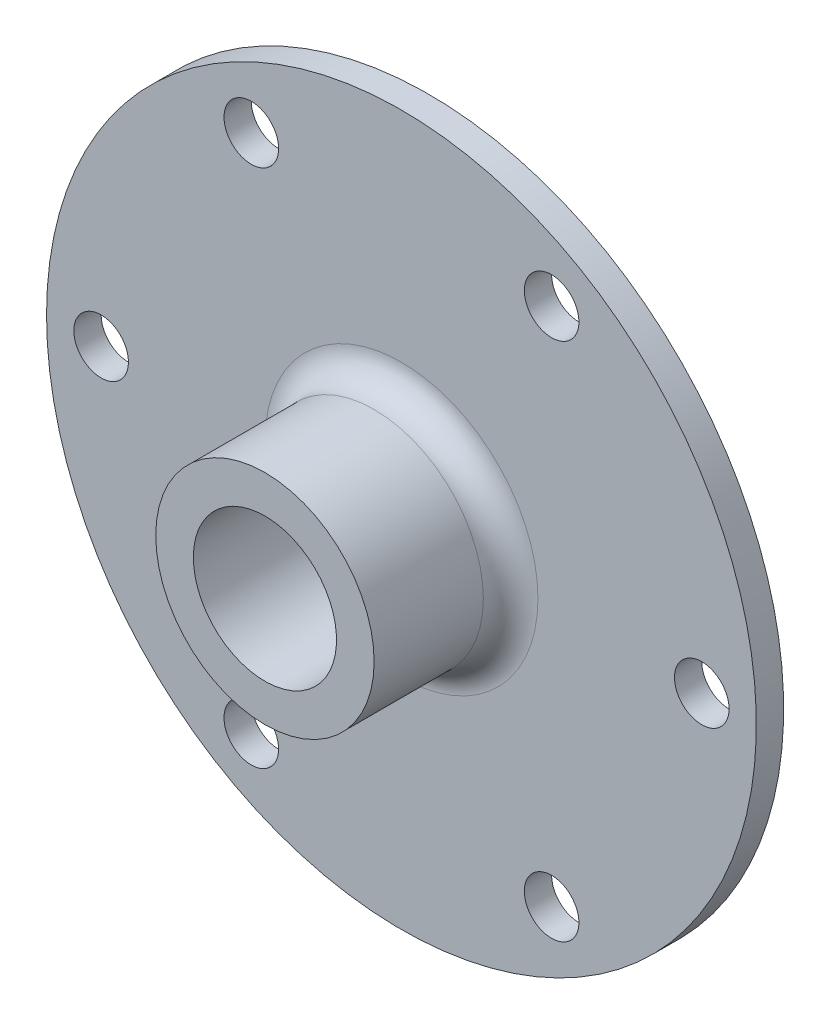
ISO-10303-21;
HEADER;
FILE_DESCRIPTION(('STEP AP214'),'2;1');
FILE_NAME('part.step','',(''),(''),'','','');
FILE_SCHEMA(('AUTOMOTIVE_DESIGN { 1 0 10303 214 1 1 1 1 }'));
ENDSEC;
DATA;
#1=APPLICATION_CONTEXT('core data for automotive mechanical design processes');
#2=APPLICATION_PROTOCOL_DEFINITION('international standard','automotive_design',2000,#1);
#3=PRODUCT_CONTEXT('',#1,'mechanical');
#4=PRODUCT('Part','Part','',(#3));
#5=PRODUCT_RELATED_PRODUCT_CATEGORY('part','',(#4));
#6=PRODUCT_DEFINITION_FORMATION('','',#4);
#7=PRODUCT_DEFINITION_CONTEXT('part definition',#1,'design');
#8=PRODUCT_DEFINITION('design','',#6,#7);
#9=PRODUCT_DEFINITION_SHAPE('','',#8);
#10=(LENGTH_UNIT() NAMED_UNIT(*) SI_UNIT(.MILLI.,.METRE.));
#11=(NAMED_UNIT(*) PLANE_ANGLE_UNIT() SI_UNIT($,.RADIAN.));
#12=(NAMED_UNIT(*) SI_UNIT($,.STERADIAN.) SOLID_ANGLE_UNIT());
#13=UNCERTAINTY_MEASURE_WITH_UNIT(LENGTH_MEASURE(1.E-05),#10,'distance_accuracy_value','');
#14=(GEOMETRIC_REPRESENTATION_CONTEXT(3) GLOBAL_UNCERTAINTY_ASSIGNED_CONTEXT((#13)) GLOBAL_UNIT_ASSIGNED_CONTEXT((#10,
#11,#12)) REPRESENTATION_CONTEXT('',''));
#15=CARTESIAN_POINT('',(0.,0.,0.));
#16=DIRECTION('',(0.,0.,1.));
#17=DIRECTION('',(1.,0.,0.));
#18=AXIS2_PLACEMENT_3D('',#15,#16,#17);
#19=CARTESIAN_POINT('',(0.,0.,19.05));
#20=DIRECTION('',(0.,0.,1.));
#21=DIRECTION('',(1.,0.,0.));
#22=AXIS2_PLACEMENT_3D('',#19,#20,#21);
#23=PLANE('',#22);
#24=CARTESIAN_POINT('',(0.,0.,19.05));
#25=DIRECTION('',(0.,0.,-1.));
#26=DIRECTION('',(-1.,0.,0.));
#27=AXIS2_PLACEMENT_3D('',#24,#25,#26);
#28=CIRCLE('',#27,12.7);
#29=CARTESIAN_POINT('',(-12.7,0.,19.05));
#30=VERTEX_POINT('',#29);
#31=EDGE_CURVE('E42',#30,#30,#28,.T.);
#32=ORIENTED_EDGE('',*,*,#31,.F.);
#33=EDGE_LOOP('',(#32));
#34=FACE_BOUND('',#33,.T.);
#35=CARTESIAN_POINT('',(0.,0.,19.05));
#36=DIRECTION('',(0.,0.,1.));
#37=DIRECTION('',(1.,0.,0.));
#38=AXIS2_PLACEMENT_3D('',#35,#36,#37);
#39=CIRCLE('',#38,8.32477297751053);
#40=CARTESIAN_POINT('',(-8.32477297751053,0.,19.05));
#41=VERTEX_POINT('',#40);
#42=EDGE_CURVE('E54',#41,#41,#39,.T.);
#43=ORIENTED_EDGE('',*,*,#42,.F.);
#44=EDGE_LOOP('',(#43));
#45=FACE_BOUND('',#44,.T.);
#46=ADVANCED_FACE('F31',(#34,#45),#23,.T.);
#47=CARTESIAN_POINT('',(0.,0.,0.));
#48=DIRECTION('',(0.,0.,-1.));
#49=DIRECTION('',(-1.,0.,0.));
#50=AXIS2_PLACEMENT_3D('',#47,#48,#49);
#51=PLANE('',#50);
#52=CARTESIAN_POINT('',(17.4625000000004,30.2459372271713,0.));
#53=DIRECTION('',(0.,0.,1.));
#54=DIRECTION('',(0.50000000000001,0.866025403784433,0.));
#55=AXIS2_PLACEMENT_3D('',#52,#53,#54);
#56=CIRCLE('',#55,3.175);
#57=CARTESIAN_POINT('',(19.0500000000004,32.9955678841869,0.));
#58=VERTEX_POINT('',#57);
#59=EDGE_CURVE('E88',#58,#58,#56,.T.);
#60=ORIENTED_EDGE('',*,*,#59,.T.);
#61=EDGE_LOOP('',(#60));
#62=FACE_BOUND('',#61,.T.);
#63=CARTESIAN_POINT('',(-17.4624999999997,30.2459372271717,0.));
#64=DIRECTION('',(0.,0.,1.));
#65=DIRECTION('',(-0.499999999999992,0.866025403784443,0.));
#66=AXIS2_PLACEMENT_3D('',#63,#64,#65);
#67=CIRCLE('',#66,3.175);
#68=CARTESIAN_POINT('',(-19.0499999999997,32.9955678841873,0.));
#69=VERTEX_POINT('',#68);
#70=EDGE_CURVE('E82',#69,#69,#67,.T.);
#71=ORIENTED_EDGE('',*,*,#70,.T.);
#72=EDGE_LOOP('',(#71));
#73=FACE_BOUND('',#72,.T.);
#74=CARTESIAN_POINT('',(-34.925,0.,0.));
#75=DIRECTION('',(0.,0.,1.));
#76=DIRECTION('',(-1.,0.,0.));
#77=AXIS2_PLACEMENT_3D('',#74,#75,#76);
#78=CIRCLE('',#77,3.175);
#79=CARTESIAN_POINT('',(-38.1,0.,0.));
#80=VERTEX_POINT('',#79);
#81=EDGE_CURVE('E76',#80,#80,#78,.T.);
#82=ORIENTED_EDGE('',*,*,#81,.T.);
#83=EDGE_LOOP('',(#82));
#84=FACE_BOUND('',#83,.T.);
#85=CARTESIAN_POINT('',(-17.4625000000001,-30.2459372271714,0.));
#86=DIRECTION('',(0.,0.,1.));
#87=DIRECTION('',(-0.500000000000004,-0.866025403784436,0.));
#88=AXIS2_PLACEMENT_3D('',#85,#86,#87);
#89=CIRCLE('',#88,3.175);
#90=CARTESIAN_POINT('',(-19.0500000000002,-32.995567884187,0.));
#91=VERTEX_POINT('',#90);
#92=EDGE_CURVE('E70',#91,#91,#89,.T.);
#93=ORIENTED_EDGE('',*,*,#92,.T.);
#94=EDGE_LOOP('',(#93));
#95=FACE_BOUND('',#94,.T.);
#96=CARTESIAN_POINT('',(17.4624999999999,-30.2459372271716,0.));
#97=DIRECTION('',(0.,0.,1.));
#98=DIRECTION('',(0.499999999999998,-0.86602540378444,0.));
#99=AXIS2_PLACEMENT_3D('',#96,#97,#98);
#100=CIRCLE('',#99,3.175);
#101=CARTESIAN_POINT('',(19.0499999999999,-32.9955678841872,0.));
#102=VERTEX_POINT('',#101);
#103=EDGE_CURVE('E64',#102,#102,#100,.T.);
#104=ORIENTED_EDGE('',*,*,#103,.T.);
#105=EDGE_LOOP('',(#104));
#106=FACE_BOUND('',#105,.T.);
#107=CARTESIAN_POINT('',(34.925,0.,0.));
#108=DIRECTION('',(0.,0.,1.));
#109=DIRECTION('',(1.,0.,0.));
#110=AXIS2_PLACEMENT_3D('',#107,#108,#109);
#111=CIRCLE('',#110,3.175);
#112=CARTESIAN_POINT('',(38.1,0.,0.));
#113=VERTEX_POINT('',#112);
#114=EDGE_CURVE('E58',#113,#113,#111,.T.);
#115=ORIENTED_EDGE('',*,*,#114,.T.);
#116=EDGE_LOOP('',(#115));
#117=FACE_BOUND('',#116,.T.);
#118=CARTESIAN_POINT('',(0.,0.,0.));
#119=DIRECTION('',(0.,0.,-1.));
#120=DIRECTION('',(-1.,0.,0.));
#121=AXIS2_PLACEMENT_3D('',#118,#119,#120);
#122=CIRCLE('',#121,41.275);
#123=CARTESIAN_POINT('',(-41.275,0.,0.));
#124=VERTEX_POINT('',#123);
#125=EDGE_CURVE('E51',#124,#124,#122,.T.);
#126=ORIENTED_EDGE('',*,*,#125,.T.);
#127=EDGE_LOOP('',(#126));
#128=FACE_BOUND('',#127,.T.);
#129=CARTESIAN_POINT('',(0.,0.,0.));
#130=DIRECTION('',(0.,0.,1.));
#131=DIRECTION('',(1.,0.,0.));
#132=AXIS2_PLACEMENT_3D('',#129,#130,#131);
#133=CIRCLE('',#132,8.32477297751053);
#134=CARTESIAN_POINT('',(-8.32477297751053,0.,0.));
#135=VERTEX_POINT('',#134);
#136=EDGE_CURVE('E55',#135,#135,#133,.T.);
#137=ORIENTED_EDGE('',*,*,#136,.T.);
#138=EDGE_LOOP('',(#137));
#139=FACE_BOUND('',#138,.T.);
#140=ADVANCED_FACE('F97',(#62,#73,#84,#95,#106,#117,#128,#139),#51,.T.);
#141=CARTESIAN_POINT('',(0.,0.,0.));
#142=DIRECTION('',(0.,0.,-1.));
#143=DIRECTION('',(-1.,0.,0.));
#144=AXIS2_PLACEMENT_3D('',#141,#142,#143);
#145=CYLINDRICAL_SURFACE('',#144,12.7);
#146=CARTESIAN_POINT('',(0.,0.,6.35));
#147=DIRECTION('',(0.,0.,1.));
#148=DIRECTION('',(1.,0.,0.));
#149=AXIS2_PLACEMENT_3D('',#146,#147,#148);
#150=CIRCLE('',#149,12.7);
#151=CARTESIAN_POINT('',(12.7,0.,6.35));
#152=VERTEX_POINT('',#151);
#153=EDGE_CURVE('E10',#152,#152,#150,.T.);
#154=ORIENTED_EDGE('',*,*,#153,.T.);
#155=EDGE_LOOP('',(#154));
#156=FACE_BOUND('',#155,.T.);
#157=ORIENTED_EDGE('',*,*,#31,.T.);
#158=EDGE_LOOP('',(#157));
#159=FACE_BOUND('',#158,.T.);
#160=ADVANCED_FACE('F111',(#156,#159),#145,.T.);
#161=CARTESIAN_POINT('',(0.,12.7,3.175));
#162=DIRECTION('',(0.,0.,1.));
#163=DIRECTION('',(1.,0.,0.));
#164=AXIS2_PLACEMENT_3D('',#161,#162,#163);
#165=PLANE('',#164);
#166=CARTESIAN_POINT('',(0.,0.,3.175));
#167=DIRECTION('',(0.,0.,1.));
#168=DIRECTION('',(1.,0.,0.));
#169=AXIS2_PLACEMENT_3D('',#166,#167,#168);
#170=CIRCLE('',#169,15.875);
#171=CARTESIAN_POINT('',(15.875,0.,3.175));
#172=VERTEX_POINT('',#171);
#173=EDGE_CURVE('E38',#172,#172,#170,.F.);
#174=ORIENTED_EDGE('',*,*,#173,.T.);
#175=EDGE_LOOP('',(#174));
#176=FACE_BOUND('',#175,.T.);
#177=CARTESIAN_POINT('',(17.4625000000004,30.2459372271713,3.175));
#178=DIRECTION('',(0.,0.,1.));
#179=DIRECTION('',(0.50000000000001,0.866025403784433,0.));
#180=AXIS2_PLACEMENT_3D('',#177,#178,#179);
#181=CIRCLE('',#180,3.175);
#182=CARTESIAN_POINT('',(19.0500000000004,32.9955678841869,3.175));
#183=VERTEX_POINT('',#182);
#184=EDGE_CURVE('E91',#183,#183,#181,.T.);
#185=ORIENTED_EDGE('',*,*,#184,.F.);
#186=EDGE_LOOP('',(#185));
#187=FACE_BOUND('',#186,.T.);
#188=CARTESIAN_POINT('',(-17.4624999999997,30.2459372271717,3.175));
#189=DIRECTION('',(0.,0.,1.));
#190=DIRECTION('',(-0.499999999999992,0.866025403784443,0.));
#191=AXIS2_PLACEMENT_3D('',#188,#189,#190);
#192=CIRCLE('',#191,3.175);
#193=CARTESIAN_POINT('',(-19.0499999999997,32.9955678841873,3.175));
#194=VERTEX_POINT('',#193);
#195=EDGE_CURVE('E85',#194,#194,#192,.T.);
#196=ORIENTED_EDGE('',*,*,#195,.F.);
#197=EDGE_LOOP('',(#196));
#198=FACE_BOUND('',#197,.T.);
#199=CARTESIAN_POINT('',(-34.925,0.,3.175));
#200=DIRECTION('',(0.,0.,1.));
#201=DIRECTION('',(-1.,0.,0.));
#202=AXIS2_PLACEMENT_3D('',#199,#200,#201);
#203=CIRCLE('',#202,3.175);
#204=CARTESIAN_POINT('',(-38.1,0.,3.175));
#205=VERTEX_POINT('',#204);
#206=EDGE_CURVE('E79',#205,#205,#203,.T.);
#207=ORIENTED_EDGE('',*,*,#206,.F.);
#208=EDGE_LOOP('',(#207));
#209=FACE_BOUND('',#208,.T.);
#210=CARTESIAN_POINT('',(-17.4625000000001,-30.2459372271714,3.175));
#211=DIRECTION('',(0.,0.,1.));
#212=DIRECTION('',(-0.500000000000004,-0.866025403784436,0.));
#213=AXIS2_PLACEMENT_3D('',#210,#211,#212);
#214=CIRCLE('',#213,3.175);
#215=CARTESIAN_POINT('',(-19.0500000000002,-32.995567884187,3.175));
#216=VERTEX_POINT('',#215);
#217=EDGE_CURVE('E73',#216,#216,#214,.T.);
#218=ORIENTED_EDGE('',*,*,#217,.F.);
#219=EDGE_LOOP('',(#218));
#220=FACE_BOUND('',#219,.T.);
#221=CARTESIAN_POINT('',(17.4624999999999,-30.2459372271716,3.175));
#222=DIRECTION('',(0.,0.,1.));
#223=DIRECTION('',(0.499999999999998,-0.86602540378444,0.));
#224=AXIS2_PLACEMENT_3D('',#221,#222,#223);
#225=CIRCLE('',#224,3.175);
#226=CARTESIAN_POINT('',(19.0499999999999,-32.9955678841872,3.175));
#227=VERTEX_POINT('',#226);
#228=EDGE_CURVE('E67',#227,#227,#225,.T.);
#229=ORIENTED_EDGE('',*,*,#228,.F.);
#230=EDGE_LOOP('',(#229));
#231=FACE_BOUND('',#230,.T.);
#232=CARTESIAN_POINT('',(34.925,0.,3.175));
#233=DIRECTION('',(0.,0.,1.));
#234=DIRECTION('',(1.,0.,0.));
#235=AXIS2_PLACEMENT_3D('',#232,#233,#234);
#236=CIRCLE('',#235,3.175);
#237=CARTESIAN_POINT('',(38.1,0.,3.175));
#238=VERTEX_POINT('',#237);
#239=EDGE_CURVE('E61',#238,#238,#236,.T.);
#240=ORIENTED_EDGE('',*,*,#239,.F.);
#241=EDGE_LOOP('',(#240));
#242=FACE_BOUND('',#241,.T.);
#243=CARTESIAN_POINT('',(0.,0.,3.175));
#244=DIRECTION('',(0.,0.,-1.));
#245=DIRECTION('',(-1.,0.,0.));
#246=AXIS2_PLACEMENT_3D('',#243,#244,#245);
#247=CIRCLE('',#246,41.275);
#248=CARTESIAN_POINT('',(-41.275,0.,3.175));
#249=VERTEX_POINT('',#248);
#250=EDGE_CURVE('E46',#249,#249,#247,.T.);
#251=ORIENTED_EDGE('',*,*,#250,.F.);
#252=EDGE_LOOP('',(#251));
#253=FACE_BOUND('',#252,.T.);
#254=ADVANCED_FACE('F107',(#176,#187,#198,#209,#220,#231,#242,#253),#165,.T.);
#255=CARTESIAN_POINT('',(0.,0.,0.));
#256=DIRECTION('',(0.,0.,-1.));
#257=DIRECTION('',(-1.,0.,0.));
#258=AXIS2_PLACEMENT_3D('',#255,#256,#257);
#259=CYLINDRICAL_SURFACE('',#258,41.275);
#260=ORIENTED_EDGE('',*,*,#250,.T.);
#261=EDGE_LOOP('',(#260));
#262=FACE_BOUND('',#261,.T.);
#263=ORIENTED_EDGE('',*,*,#125,.F.);
#264=EDGE_LOOP('',(#263));
#265=FACE_BOUND('',#264,.T.);
#266=ADVANCED_FACE('F110',(#262,#265),#259,.T.);
#267=CARTESIAN_POINT('',(0.,0.,19.05));
#268=DIRECTION('',(0.,0.,-1.));
#269=DIRECTION('',(-1.,0.,0.));
#270=AXIS2_PLACEMENT_3D('',#267,#268,#269);
#271=CYLINDRICAL_SURFACE('',#270,8.32477297751053);
#272=CARTESIAN_POINT('',(-8.32477297751053,0.,19.05));
#273=CARTESIAN_POINT('',(-8.32477297751053,0.,18.8515625));
#274=CARTESIAN_POINT('',(-8.32477297751053,0.,18.653125));
#275=CARTESIAN_POINT('',(-8.32477297751053,0.,18.25625));
#276=CARTESIAN_POINT('',(-8.32477297751053,0.,18.0578125));
#277=CARTESIAN_POINT('',(-8.32477297751053,0.,17.6609375));
#278=CARTESIAN_POINT('',(-8.32477297751053,0.,17.4625));
#279=CARTESIAN_POINT('',(-8.32477297751053,0.,17.065625));
#280=CARTESIAN_POINT('',(-8.32477297751053,0.,16.8671875));
#281=CARTESIAN_POINT('',(-8.32477297751053,0.,16.4703125));
#282=CARTESIAN_POINT('',(-8.32477297751053,0.,16.271875));
#283=CARTESIAN_POINT('',(-8.32477297751053,0.,15.875));
#284=CARTESIAN_POINT('',(-8.32477297751053,0.,15.6765625));
#285=CARTESIAN_POINT('',(-8.32477297751053,0.,15.2796875));
#286=CARTESIAN_POINT('',(-8.32477297751053,0.,15.08125));
#287=CARTESIAN_POINT('',(-8.32477297751053,0.,14.684375));
#288=CARTESIAN_POINT('',(-8.32477297751053,0.,14.4859375));
#289=CARTESIAN_POINT('',(-8.32477297751053,0.,14.0890625));
#290=CARTESIAN_POINT('',(-8.32477297751053,0.,13.890625));
#291=CARTESIAN_POINT('',(-8.32477297751053,0.,13.49375));
#292=CARTESIAN_POINT('',(-8.32477297751053,0.,13.2953125));
#293=CARTESIAN_POINT('',(-8.32477297751053,0.,12.8984375));
#294=CARTESIAN_POINT('',(-8.32477297751053,0.,12.7));
#295=CARTESIAN_POINT('',(-8.32477297751053,0.,12.303125));
#296=CARTESIAN_POINT('',(-8.32477297751053,0.,12.1046875));
#297=CARTESIAN_POINT('',(-8.32477297751053,0.,11.7078125));
#298=CARTESIAN_POINT('',(-8.32477297751053,0.,11.509375));
#299=CARTESIAN_POINT('',(-8.32477297751053,0.,11.1125));
#300=CARTESIAN_POINT('',(-8.32477297751053,0.,10.9140625));
#301=CARTESIAN_POINT('',(-8.32477297751053,0.,10.5171875));
#302=CARTESIAN_POINT('',(-8.32477297751053,0.,10.31875));
#303=CARTESIAN_POINT('',(-8.32477297751053,0.,9.921875));
#304=CARTESIAN_POINT('',(-8.32477297751053,0.,9.7234375));
#305=CARTESIAN_POINT('',(-8.32477297751053,0.,9.3265625));
#306=CARTESIAN_POINT('',(-8.32477297751053,0.,9.128125));
#307=CARTESIAN_POINT('',(-8.32477297751053,0.,8.73125));
#308=CARTESIAN_POINT('',(-8.32477297751053,0.,8.5328125));
#309=CARTESIAN_POINT('',(-8.32477297751053,0.,8.1359375));
#310=CARTESIAN_POINT('',(-8.32477297751053,0.,7.9375));
#311=CARTESIAN_POINT('',(-8.32477297751053,0.,7.540625));
#312=CARTESIAN_POINT('',(-8.32477297751053,0.,7.3421875));
#313=CARTESIAN_POINT('',(-8.32477297751053,0.,6.9453125));
#314=CARTESIAN_POINT('',(-8.32477297751053,0.,6.746875));
#315=CARTESIAN_POINT('',(-8.32477297751053,0.,6.35));
#316=CARTESIAN_POINT('',(-8.32477297751053,0.,6.1515625));
#317=CARTESIAN_POINT('',(-8.32477297751053,0.,5.7546875));
#318=CARTESIAN_POINT('',(-8.32477297751053,0.,5.55625));
#319=CARTESIAN_POINT('',(-8.32477297751053,0.,5.159375));
#320=CARTESIAN_POINT('',(-8.32477297751053,0.,4.9609375));
#321=CARTESIAN_POINT('',(-8.32477297751053,0.,4.5640625));
#322=CARTESIAN_POINT('',(-8.32477297751053,0.,4.365625));
#323=CARTESIAN_POINT('',(-8.32477297751053,0.,3.96875));
#324=CARTESIAN_POINT('',(-8.32477297751053,0.,3.7703125));
#325=CARTESIAN_POINT('',(-8.32477297751053,0.,3.3734375));
#326=CARTESIAN_POINT('',(-8.32477297751053,0.,3.175));
#327=CARTESIAN_POINT('',(-8.32477297751053,0.,2.778125));
#328=CARTESIAN_POINT('',(-8.32477297751053,0.,2.5796875));
#329=CARTESIAN_POINT('',(-8.32477297751053,0.,2.1828125));
#330=CARTESIAN_POINT('',(-8.32477297751053,0.,1.984375));
#331=CARTESIAN_POINT('',(-8.32477297751053,0.,1.5875));
#332=CARTESIAN_POINT('',(-8.32477297751053,0.,1.3890625));
#333=CARTESIAN_POINT('',(-8.32477297751053,0.,0.992187500000001));
#334=CARTESIAN_POINT('',(-8.32477297751053,0.,0.793750000000001));
#335=CARTESIAN_POINT('',(-8.32477297751053,0.,0.396875));
#336=CARTESIAN_POINT('',(-8.32477297751053,0.,0.1984375));
#337=CARTESIAN_POINT('',(-8.32477297751053,0.,0.));
#338=B_SPLINE_CURVE_WITH_KNOTS('',3,(#272,#273,#274,#275,#276,#277,#278,#279,#280,#281,#282,
#283,#284,#285,#286,#287,#288,#289,#290,#291,#292,#293,#294,#295,#296,#297,#298,#299,#300,#301,
#302,#303,#304,#305,#306,#307,#308,#309,#310,#311,#312,#313,#314,#315,#316,#317,#318,#319,#320,
#321,#322,#323,#324,#325,#326,#327,#328,#329,#330,#331,#332,#333,#334,#335,#336,#337),
.UNSPECIFIED.,.F.,.F.,(4,2,2,2,2,2,2,2,2,2,2,2,2,2,2,2,2,2,2,2,2,2,2,2,2,2,2,2,2,2,2,2,4),(0.,
0.5953125,1.190625,1.7859375,2.38125,2.9765625,3.571875,4.1671875,4.7625,5.3578125,5.953125,
6.5484375,7.14375,7.7390625,8.334375,8.9296875,9.525,10.1203125,10.715625,11.3109375,11.90625,
12.5015625,13.096875,13.6921875,14.2875,14.8828125,15.478125,16.0734375,16.66875,17.2640625,
17.859375,18.4546875,19.05),.UNSPECIFIED.);
#339=EDGE_CURVE('BSEAM127',#41,#135,#338,.T.);
#340=ORIENTED_EDGE('',*,*,#42,.T.);
#341=ORIENTED_EDGE('',*,*,#136,.F.);
#342=ORIENTED_EDGE('',*,*,#339,.T.);
#343=ORIENTED_EDGE('',*,*,#339,.F.);
#344=EDGE_LOOP('',(#340,#342,#341,#343));
#345=FACE_BOUND('',#344,.T.);
#346=ADVANCED_FACE('F127',(#345),#271,.F.);
#347=CARTESIAN_POINT('',(34.925,0.,0.));
#348=DIRECTION('',(0.,0.,1.));
#349=DIRECTION('',(1.,0.,0.));
#350=AXIS2_PLACEMENT_3D('',#347,#348,#349);
#351=CYLINDRICAL_SURFACE('',#350,3.175);
#352=ORIENTED_EDGE('',*,*,#114,.F.);
#353=EDGE_LOOP('',(#352));
#354=FACE_BOUND('',#353,.T.);
#355=ORIENTED_EDGE('',*,*,#239,.T.);
#356=EDGE_LOOP('',(#355));
#357=FACE_BOUND('',#356,.T.);
#358=ADVANCED_FACE('F137',(#354,#357),#351,.F.);
#359=CARTESIAN_POINT('',(17.4624999999999,-30.2459372271716,0.));
#360=DIRECTION('',(0.,0.,1.));
#361=DIRECTION('',(1.,0.,0.));
#362=AXIS2_PLACEMENT_3D('',#359,#360,#361);
#363=CYLINDRICAL_SURFACE('',#362,3.175);
#364=ORIENTED_EDGE('',*,*,#103,.F.);
#365=EDGE_LOOP('',(#364));
#366=FACE_BOUND('',#365,.T.);
#367=ORIENTED_EDGE('',*,*,#228,.T.);
#368=EDGE_LOOP('',(#367));
#369=FACE_BOUND('',#368,.T.);
#370=ADVANCED_FACE('F143',(#366,#369),#363,.F.);
#371=CARTESIAN_POINT('',(-17.4625000000001,-30.2459372271714,0.));
#372=DIRECTION('',(0.,0.,1.));
#373=DIRECTION('',(1.,0.,0.));
#374=AXIS2_PLACEMENT_3D('',#371,#372,#373);
#375=CYLINDRICAL_SURFACE('',#374,3.175);
#376=ORIENTED_EDGE('',*,*,#92,.F.);
#377=EDGE_LOOP('',(#376));
#378=FACE_BOUND('',#377,.T.);
#379=ORIENTED_EDGE('',*,*,#217,.T.);
#380=EDGE_LOOP('',(#379));
#381=FACE_BOUND('',#380,.T.);
#382=ADVANCED_FACE('F188',(#378,#381),#375,.F.);
#383=CARTESIAN_POINT('',(-34.925,0.,0.));
#384=DIRECTION('',(0.,0.,1.));
#385=DIRECTION('',(1.,0.,0.));
#386=AXIS2_PLACEMENT_3D('',#383,#384,#385);
#387=CYLINDRICAL_SURFACE('',#386,3.175);
#388=ORIENTED_EDGE('',*,*,#81,.F.);
#389=EDGE_LOOP('',(#388));
#390=FACE_BOUND('',#389,.T.);
#391=ORIENTED_EDGE('',*,*,#206,.T.);
#392=EDGE_LOOP('',(#391));
#393=FACE_BOUND('',#392,.T.);
#394=ADVANCED_FACE('F180',(#390,#393),#387,.F.);
#395=CARTESIAN_POINT('',(-17.4624999999997,30.2459372271717,0.));
#396=DIRECTION('',(0.,0.,1.));
#397=DIRECTION('',(1.,0.,0.));
#398=AXIS2_PLACEMENT_3D('',#395,#396,#397);
#399=CYLINDRICAL_SURFACE('',#398,3.175);
#400=ORIENTED_EDGE('',*,*,#70,.F.);
#401=EDGE_LOOP('',(#400));
#402=FACE_BOUND('',#401,.T.);
#403=ORIENTED_EDGE('',*,*,#195,.T.);
#404=EDGE_LOOP('',(#403));
#405=FACE_BOUND('',#404,.T.);
#406=ADVANCED_FACE('F103',(#402,#405),#399,.F.);
#407=CARTESIAN_POINT('',(17.4625000000004,30.2459372271713,0.));
#408=DIRECTION('',(0.,0.,1.));
#409=DIRECTION('',(1.,0.,0.));
#410=AXIS2_PLACEMENT_3D('',#407,#408,#409);
#411=CYLINDRICAL_SURFACE('',#410,3.175);
#412=ORIENTED_EDGE('',*,*,#59,.F.);
#413=EDGE_LOOP('',(#412));
#414=FACE_BOUND('',#413,.T.);
#415=ORIENTED_EDGE('',*,*,#184,.T.);
#416=EDGE_LOOP('',(#415));
#417=FACE_BOUND('',#416,.T.);
#418=ADVANCED_FACE('F100',(#414,#417),#411,.F.);
#419=CARTESIAN_POINT('',(0.,0.,6.35));
#420=DIRECTION('',(0.,0.,1.));
#421=DIRECTION('',(1.,0.,0.));
#422=AXIS2_PLACEMENT_3D('',#419,#420,#421);
#423=TOROIDAL_SURFACE('',#422,15.875,3.175);
#424=ORIENTED_EDGE('',*,*,#153,.F.);
#425=EDGE_LOOP('',(#424));
#426=FACE_BOUND('',#425,.T.);
#427=ORIENTED_EDGE('',*,*,#173,.F.);
#428=EDGE_LOOP('',(#427));
#429=FACE_BOUND('',#428,.T.);
#430=ADVANCED_FACE('F33',(#426,#429),#423,.F.);
#431=CLOSED_SHELL('',(#46,#140,#160,#254,#266,#346,#358,#370,#382,#394,#406,#418,#430));
#432=MANIFOLD_SOLID_BREP('B2',#431);
#433=ADVANCED_BREP_SHAPE_REPRESENTATION('',(#18,#432),#14);
#434=SHAPE_DEFINITION_REPRESENTATION(#9,#433);
ENDSEC;
END-ISO-10303-21;
